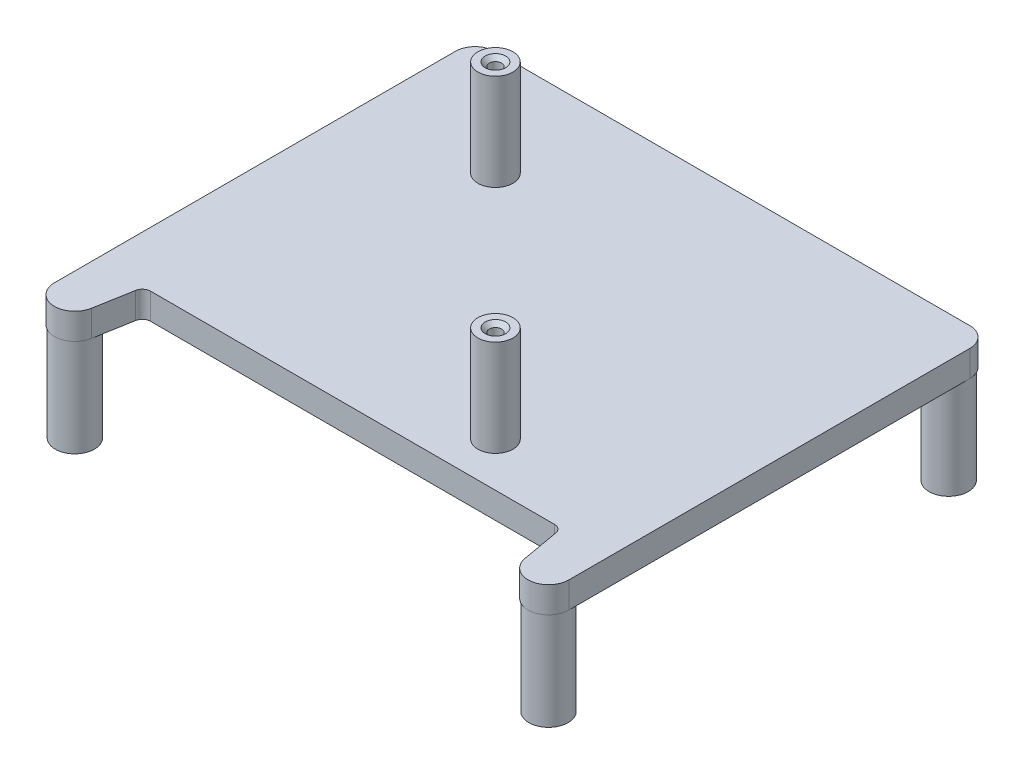
ISO-10303-21;
HEADER;
FILE_DESCRIPTION(('STEP AP214'),'2;1');
FILE_NAME('part.step','',(''),(''),'','','');
FILE_SCHEMA(('AUTOMOTIVE_DESIGN { 1 0 10303 214 1 1 1 1 }'));
ENDSEC;
DATA;
#1=APPLICATION_CONTEXT('core data for automotive mechanical design processes');
#2=APPLICATION_PROTOCOL_DEFINITION('international standard','automotive_design',2000,#1);
#3=PRODUCT_CONTEXT('',#1,'mechanical');
#4=PRODUCT('Part','Part','',(#3));
#5=PRODUCT_RELATED_PRODUCT_CATEGORY('part','',(#4));
#6=PRODUCT_DEFINITION_FORMATION('','',#4);
#7=PRODUCT_DEFINITION_CONTEXT('part definition',#1,'design');
#8=PRODUCT_DEFINITION('design','',#6,#7);
#9=PRODUCT_DEFINITION_SHAPE('','',#8);
#10=(LENGTH_UNIT() NAMED_UNIT(*) SI_UNIT(.MILLI.,.METRE.));
#11=(NAMED_UNIT(*) PLANE_ANGLE_UNIT() SI_UNIT($,.RADIAN.));
#12=(NAMED_UNIT(*) SI_UNIT($,.STERADIAN.) SOLID_ANGLE_UNIT());
#13=UNCERTAINTY_MEASURE_WITH_UNIT(LENGTH_MEASURE(1.E-05),#10,'distance_accuracy_value','');
#14=(GEOMETRIC_REPRESENTATION_CONTEXT(3) GLOBAL_UNCERTAINTY_ASSIGNED_CONTEXT((#13)) GLOBAL_UNIT_ASSIGNED_CONTEXT((#10,
#11,#12)) REPRESENTATION_CONTEXT('',''));
#15=CARTESIAN_POINT('',(0.,0.,0.));
#16=DIRECTION('',(0.,0.,1.));
#17=DIRECTION('',(1.,0.,0.));
#18=AXIS2_PLACEMENT_3D('',#15,#16,#17);
#19=CARTESIAN_POINT('',(-28.9987760738904,0.,24.4987760738904));
#20=DIRECTION('',(0.,-1.,0.));
#21=DIRECTION('',(0.,0.,-1.));
#22=AXIS2_PLACEMENT_3D('',#19,#20,#21);
#23=CYLINDRICAL_SURFACE('',#22,2.50122392610958);
#24=DIRECTION('',(0.,-1.,0.));
#25=VECTOR('',#24,1.);
#26=CARTESIAN_POINT('',(-31.5,3.2,24.4987760738904));
#27=LINE('',#26,#25);
#28=CARTESIAN_POINT('',(-31.5,0.,24.4987760738904));
#29=VERTEX_POINT('',#28);
#30=CARTESIAN_POINT('',(-31.5,3.2,24.4987760738904));
#31=VERTEX_POINT('',#30);
#32=EDGE_CURVE('E257',#29,#31,#27,.F.);
#33=ORIENTED_EDGE('',*,*,#32,.F.);
#34=CARTESIAN_POINT('',(-28.9987760738904,0.,24.4987760738904));
#35=DIRECTION('',(0.,1.,0.));
#36=DIRECTION('',(0.,0.,1.));
#37=AXIS2_PLACEMENT_3D('',#34,#35,#36);
#38=CIRCLE('',#37,2.50122392610958);
#39=CARTESIAN_POINT('',(-26.5355513594381,0.,24.9331090505963));
#40=VERTEX_POINT('',#39);
#41=EDGE_CURVE('E163',#40,#29,#38,.F.);
#42=ORIENTED_EDGE('',*,*,#41,.F.);
#43=DIRECTION('',(0.,1.,0.));
#44=VECTOR('',#43,1.);
#45=CARTESIAN_POINT('',(-26.5355513594381,0.,24.9331090505963));
#46=LINE('',#45,#44);
#47=CARTESIAN_POINT('',(-26.5355513594381,3.2,24.9331090505963));
#48=VERTEX_POINT('',#47);
#49=EDGE_CURVE('E259',#48,#40,#46,.F.);
#50=ORIENTED_EDGE('',*,*,#49,.F.);
#51=CARTESIAN_POINT('',(-28.9987760738904,3.2,24.4987760738904));
#52=DIRECTION('',(0.,1.,0.));
#53=DIRECTION('',(0.,0.,1.));
#54=AXIS2_PLACEMENT_3D('',#51,#52,#53);
#55=CIRCLE('',#54,2.50122392610958);
#56=EDGE_CURVE('E263',#31,#48,#55,.T.);
#57=ORIENTED_EDGE('',*,*,#56,.F.);
#58=EDGE_LOOP('',(#33,#42,#50,#57));
#59=FACE_BOUND('',#58,.T.);
#60=ADVANCED_FACE('F51',(#59),#23,.T.);
#61=CARTESIAN_POINT('',(28.9987760738904,3.2,24.4987760738904));
#62=DIRECTION('',(0.,-1.,0.));
#63=DIRECTION('',(0.,0.,-1.));
#64=AXIS2_PLACEMENT_3D('',#61,#62,#63);
#65=CYLINDRICAL_SURFACE('',#64,2.50122392610958);
#66=DIRECTION('',(0.,1.,0.));
#67=VECTOR('',#66,1.);
#68=CARTESIAN_POINT('',(31.5,3.2,24.4987760738904));
#69=LINE('',#68,#67);
#70=CARTESIAN_POINT('',(31.5,3.2,24.4987760738904));
#71=VERTEX_POINT('',#70);
#72=CARTESIAN_POINT('',(31.5,0.,24.4987760738904));
#73=VERTEX_POINT('',#72);
#74=EDGE_CURVE('E247',#71,#73,#69,.F.);
#75=ORIENTED_EDGE('',*,*,#74,.F.);
#76=CARTESIAN_POINT('',(28.9987760738904,3.2,24.4987760738904));
#77=DIRECTION('',(0.,1.,0.));
#78=DIRECTION('',(0.,0.,1.));
#79=AXIS2_PLACEMENT_3D('',#76,#77,#78);
#80=CIRCLE('',#79,2.50122392610958);
#81=CARTESIAN_POINT('',(26.5355513594381,3.2,24.9331090505963));
#82=VERTEX_POINT('',#81);
#83=EDGE_CURVE('E253',#82,#71,#80,.T.);
#84=ORIENTED_EDGE('',*,*,#83,.F.);
#85=DIRECTION('',(0.,-1.,0.));
#86=VECTOR('',#85,1.);
#87=CARTESIAN_POINT('',(26.5355513594381,3.2,24.9331090505963));
#88=LINE('',#87,#86);
#89=CARTESIAN_POINT('',(26.5355513594381,0.,24.9331090505963));
#90=VERTEX_POINT('',#89);
#91=EDGE_CURVE('E250',#90,#82,#88,.F.);
#92=ORIENTED_EDGE('',*,*,#91,.F.);
#93=CARTESIAN_POINT('',(28.9987760738904,0.,24.4987760738904));
#94=DIRECTION('',(0.,1.,0.));
#95=DIRECTION('',(0.,0.,1.));
#96=AXIS2_PLACEMENT_3D('',#93,#94,#95);
#97=CIRCLE('',#96,2.50122392610958);
#98=EDGE_CURVE('E255',#73,#90,#97,.F.);
#99=ORIENTED_EDGE('',*,*,#98,.F.);
#100=EDGE_LOOP('',(#75,#84,#92,#99));
#101=FACE_BOUND('',#100,.T.);
#102=ADVANCED_FACE('F300',(#101),#65,.T.);
#103=CARTESIAN_POINT('',(0.,3.2,19.5));
#104=DIRECTION('',(0.,0.,-1.));
#105=DIRECTION('',(-1.,0.,0.));
#106=AXIS2_PLACEMENT_3D('',#103,#104,#105);
#107=PLANE('',#106);
#108=DIRECTION('',(1.,0.,0.));
#109=VECTOR('',#108,1.);
#110=CARTESIAN_POINT('',(0.,0.,19.5));
#111=LINE('',#110,#109);
#112=CARTESIAN_POINT('',(-24.7384480135093,0.,19.5));
#113=VERTEX_POINT('',#112);
#114=CARTESIAN_POINT('',(24.7384480135093,0.,19.5));
#115=VERTEX_POINT('',#114);
#116=EDGE_CURVE('E279',#113,#115,#111,.T.);
#117=ORIENTED_EDGE('',*,*,#116,.T.);
#118=DIRECTION('',(0.,-1.,0.));
#119=VECTOR('',#118,1.);
#120=CARTESIAN_POINT('',(24.7384480135093,3.2,19.5));
#121=LINE('',#120,#119);
#122=CARTESIAN_POINT('',(24.7384480135093,3.2,19.5));
#123=VERTEX_POINT('',#122);
#124=EDGE_CURVE('E268',#115,#123,#121,.F.);
#125=ORIENTED_EDGE('',*,*,#124,.T.);
#126=DIRECTION('',(1.,0.,0.));
#127=VECTOR('',#126,1.);
#128=CARTESIAN_POINT('',(0.,3.2,19.5));
#129=LINE('',#128,#127);
#130=CARTESIAN_POINT('',(-24.7384480135093,3.2,19.5));
#131=VERTEX_POINT('',#130);
#132=EDGE_CURVE('E165',#131,#123,#129,.T.);
#133=ORIENTED_EDGE('',*,*,#132,.F.);
#134=DIRECTION('',(0.,-1.,0.));
#135=VECTOR('',#134,1.);
#136=CARTESIAN_POINT('',(-24.7384480135093,3.2,19.5));
#137=LINE('',#136,#135);
#138=EDGE_CURVE('E265',#131,#113,#137,.T.);
#139=ORIENTED_EDGE('',*,*,#138,.T.);
#140=EDGE_LOOP('',(#117,#125,#133,#139));
#141=FACE_BOUND('',#140,.T.);
#142=ADVANCED_FACE('F285',(#141),#107,.F.);
#143=CARTESIAN_POINT('',(31.5,3.2,0.));
#144=DIRECTION('',(1.,0.,0.));
#145=DIRECTION('',(0.,0.,-1.));
#146=AXIS2_PLACEMENT_3D('',#143,#144,#145);
#147=PLANE('',#146);
#148=DIRECTION('',(0.,0.,1.));
#149=VECTOR('',#148,1.);
#150=CARTESIAN_POINT('',(31.5,3.2,0.));
#151=LINE('',#150,#149);
#152=CARTESIAN_POINT('',(31.5,3.2,-24.6));
#153=VERTEX_POINT('',#152);
#154=EDGE_CURVE('E169',#153,#71,#151,.T.);
#155=ORIENTED_EDGE('',*,*,#154,.T.);
#156=ORIENTED_EDGE('',*,*,#74,.T.);
#157=DIRECTION('',(0.,0.,1.));
#158=VECTOR('',#157,1.);
#159=CARTESIAN_POINT('',(31.5,0.,0.));
#160=LINE('',#159,#158);
#161=CARTESIAN_POINT('',(31.5,0.,-24.6));
#162=VERTEX_POINT('',#161);
#163=EDGE_CURVE('E171',#162,#73,#160,.T.);
#164=ORIENTED_EDGE('',*,*,#163,.F.);
#165=DIRECTION('',(0.,-1.,0.));
#166=VECTOR('',#165,1.);
#167=CARTESIAN_POINT('',(31.5,3.2,-24.6));
#168=LINE('',#167,#166);
#169=EDGE_CURVE('E245',#162,#153,#168,.F.);
#170=ORIENTED_EDGE('',*,*,#169,.T.);
#171=EDGE_LOOP('',(#155,#156,#164,#170));
#172=FACE_BOUND('',#171,.T.);
#173=ADVANCED_FACE('F317',(#172),#147,.T.);
#174=CARTESIAN_POINT('',(0.,3.2,-27.));
#175=DIRECTION('',(0.,0.,-1.));
#176=DIRECTION('',(-1.,0.,0.));
#177=AXIS2_PLACEMENT_3D('',#174,#175,#176);
#178=PLANE('',#177);
#179=DIRECTION('',(1.,0.,0.));
#180=VECTOR('',#179,1.);
#181=CARTESIAN_POINT('',(0.,0.,-27.));
#182=LINE('',#181,#180);
#183=CARTESIAN_POINT('',(-29.1,0.,-27.));
#184=VERTEX_POINT('',#183);
#185=CARTESIAN_POINT('',(29.1,0.,-27.));
#186=VERTEX_POINT('',#185);
#187=EDGE_CURVE('E166',#184,#186,#182,.T.);
#188=ORIENTED_EDGE('',*,*,#187,.F.);
#189=DIRECTION('',(0.,-1.,0.));
#190=VECTOR('',#189,1.);
#191=CARTESIAN_POINT('',(-29.1,3.2,-27.));
#192=LINE('',#191,#190);
#193=CARTESIAN_POINT('',(-29.1,3.2,-27.));
#194=VERTEX_POINT('',#193);
#195=EDGE_CURVE('E144',#184,#194,#192,.F.);
#196=ORIENTED_EDGE('',*,*,#195,.T.);
#197=DIRECTION('',(1.,0.,0.));
#198=VECTOR('',#197,1.);
#199=CARTESIAN_POINT('',(0.,3.2,-27.));
#200=LINE('',#199,#198);
#201=CARTESIAN_POINT('',(29.1,3.2,-27.));
#202=VERTEX_POINT('',#201);
#203=EDGE_CURVE('E307',#194,#202,#200,.T.);
#204=ORIENTED_EDGE('',*,*,#203,.T.);
#205=DIRECTION('',(0.,-1.,0.));
#206=VECTOR('',#205,1.);
#207=CARTESIAN_POINT('',(29.1,3.2,-27.));
#208=LINE('',#207,#206);
#209=EDGE_CURVE('E148',#202,#186,#208,.T.);
#210=ORIENTED_EDGE('',*,*,#209,.T.);
#211=EDGE_LOOP('',(#188,#196,#204,#210));
#212=FACE_BOUND('',#211,.T.);
#213=ADVANCED_FACE('F314',(#212),#178,.T.);
#214=CARTESIAN_POINT('',(-31.5,3.2,0.));
#215=DIRECTION('',(1.,0.,0.));
#216=DIRECTION('',(0.,0.,-1.));
#217=AXIS2_PLACEMENT_3D('',#214,#215,#216);
#218=PLANE('',#217);
#219=DIRECTION('',(0.,0.,1.));
#220=VECTOR('',#219,1.);
#221=CARTESIAN_POINT('',(-31.5,0.,0.));
#222=LINE('',#221,#220);
#223=CARTESIAN_POINT('',(-31.5,0.,-24.6));
#224=VERTEX_POINT('',#223);
#225=EDGE_CURVE('E156',#224,#29,#222,.T.);
#226=ORIENTED_EDGE('',*,*,#225,.T.);
#227=ORIENTED_EDGE('',*,*,#32,.T.);
#228=DIRECTION('',(0.,0.,1.));
#229=VECTOR('',#228,1.);
#230=CARTESIAN_POINT('',(-31.5,3.2,0.));
#231=LINE('',#230,#229);
#232=CARTESIAN_POINT('',(-31.5,3.2,-24.6));
#233=VERTEX_POINT('',#232);
#234=EDGE_CURVE('E158',#233,#31,#231,.T.);
#235=ORIENTED_EDGE('',*,*,#234,.F.);
#236=DIRECTION('',(0.,-1.,0.));
#237=VECTOR('',#236,1.);
#238=CARTESIAN_POINT('',(-31.5,0.,-24.6));
#239=LINE('',#238,#237);
#240=EDGE_CURVE('E143',#233,#224,#239,.T.);
#241=ORIENTED_EDGE('',*,*,#240,.T.);
#242=EDGE_LOOP('',(#226,#227,#235,#241));
#243=FACE_BOUND('',#242,.T.);
#244=ADVANCED_FACE('F154',(#243),#218,.F.);
#245=CARTESIAN_POINT('',(0.,3.2,0.));
#246=DIRECTION('',(0.,1.,0.));
#247=DIRECTION('',(0.,0.,1.));
#248=AXIS2_PLACEMENT_3D('',#245,#246,#247);
#249=PLANE('',#248);
#250=CARTESIAN_POINT('',(12.075,3.2,14.075));
#251=DIRECTION('',(0.,1.,0.));
#252=DIRECTION('',(0.,0.,1.));
#253=AXIS2_PLACEMENT_3D('',#250,#251,#252);
#254=CIRCLE('',#253,2.15);
#255=CARTESIAN_POINT('',(12.075,3.2,16.225));
#256=VERTEX_POINT('',#255);
#257=EDGE_CURVE('E351',#256,#256,#254,.T.);
#258=ORIENTED_EDGE('',*,*,#257,.F.);
#259=EDGE_LOOP('',(#258));
#260=FACE_BOUND('',#259,.T.);
#261=CARTESIAN_POINT('',(-16.125,3.2,-14.125));
#262=DIRECTION('',(0.,1.,0.));
#263=DIRECTION('',(0.,0.,1.));
#264=AXIS2_PLACEMENT_3D('',#261,#262,#263);
#265=CIRCLE('',#264,2.15);
#266=CARTESIAN_POINT('',(-16.125,3.2,-11.975));
#267=VERTEX_POINT('',#266);
#268=EDGE_CURVE('E345',#267,#267,#265,.T.);
#269=ORIENTED_EDGE('',*,*,#268,.F.);
#270=EDGE_LOOP('',(#269));
#271=FACE_BOUND('',#270,.T.);
#272=ORIENTED_EDGE('',*,*,#234,.T.);
#273=ORIENTED_EDGE('',*,*,#56,.T.);
#274=DIRECTION('',(0.173648177666927,0.,-0.984807753012209));
#275=VECTOR('',#274,1.);
#276=CARTESIAN_POINT('',(-21.4715938146741,3.2,-3.78602130833997));
#277=LINE('',#276,#275);
#278=CARTESIAN_POINT('',(-25.7232557665215,3.2,20.3263518223331));
#279=VERTEX_POINT('',#278);
#280=EDGE_CURVE('E234',#48,#279,#277,.T.);
#281=ORIENTED_EDGE('',*,*,#280,.T.);
#282=CARTESIAN_POINT('',(-24.7384480135093,3.2,20.5));
#283=DIRECTION('',(0.,1.,0.));
#284=DIRECTION('',(0.,0.,1.));
#285=AXIS2_PLACEMENT_3D('',#282,#283,#284);
#286=CIRCLE('',#285,1.);
#287=EDGE_CURVE('E12',#279,#131,#286,.F.);
#288=ORIENTED_EDGE('',*,*,#287,.T.);
#289=ORIENTED_EDGE('',*,*,#132,.T.);
#290=CARTESIAN_POINT('',(24.7384480135093,3.2,20.5));
#291=DIRECTION('',(0.,1.,0.));
#292=DIRECTION('',(0.,0.,1.));
#293=AXIS2_PLACEMENT_3D('',#290,#291,#292);
#294=CIRCLE('',#293,1.);
#295=CARTESIAN_POINT('',(25.7232557665215,3.2,20.3263518223331));
#296=VERTEX_POINT('',#295);
#297=EDGE_CURVE('E274',#123,#296,#294,.F.);
#298=ORIENTED_EDGE('',*,*,#297,.T.);
#299=DIRECTION('',(-0.173648177666927,0.,-0.984807753012209));
#300=VECTOR('',#299,1.);
#301=CARTESIAN_POINT('',(21.4715938146741,3.2,-3.78602130833997));
#302=LINE('',#301,#300);
#303=EDGE_CURVE('E159',#296,#82,#302,.F.);
#304=ORIENTED_EDGE('',*,*,#303,.T.);
#305=ORIENTED_EDGE('',*,*,#83,.T.);
#306=ORIENTED_EDGE('',*,*,#154,.F.);
#307=CARTESIAN_POINT('',(29.1,3.2,-24.6));
#308=DIRECTION('',(0.,1.,0.));
#309=DIRECTION('',(0.,0.,1.));
#310=AXIS2_PLACEMENT_3D('',#307,#308,#309);
#311=CIRCLE('',#310,2.4);
#312=EDGE_CURVE('E241',#153,#202,#311,.T.);
#313=ORIENTED_EDGE('',*,*,#312,.T.);
#314=ORIENTED_EDGE('',*,*,#203,.F.);
#315=CARTESIAN_POINT('',(-29.1,3.2,-24.6));
#316=DIRECTION('',(0.,1.,0.));
#317=DIRECTION('',(0.,0.,1.));
#318=AXIS2_PLACEMENT_3D('',#315,#316,#317);
#319=CIRCLE('',#318,2.4);
#320=EDGE_CURVE('E243',#194,#233,#319,.T.);
#321=ORIENTED_EDGE('',*,*,#320,.T.);
#322=EDGE_LOOP('',(#272,#273,#281,#288,#289,#298,#304,#305,#306,#313,#314,#321));
#323=FACE_BOUND('',#322,.T.);
#324=ADVANCED_FACE('F293',(#260,#271,#323),#249,.T.);
#325=CARTESIAN_POINT('',(0.,0.,0.));
#326=DIRECTION('',(0.,1.,0.));
#327=DIRECTION('',(0.,0.,1.));
#328=AXIS2_PLACEMENT_3D('',#325,#326,#327);
#329=PLANE('',#328);
#330=CARTESIAN_POINT('',(-29.,0.,24.5));
#331=DIRECTION('',(0.,1.,0.));
#332=DIRECTION('',(0.,0.,1.));
#333=AXIS2_PLACEMENT_3D('',#330,#331,#332);
#334=CIRCLE('',#333,2.4);
#335=CARTESIAN_POINT('',(-29.,0.,26.9));
#336=VERTEX_POINT('',#335);
#337=EDGE_CURVE('E184',#336,#336,#334,.F.);
#338=ORIENTED_EDGE('',*,*,#337,.F.);
#339=EDGE_LOOP('',(#338));
#340=FACE_BOUND('',#339,.T.);
#341=CARTESIAN_POINT('',(29.,0.,24.5));
#342=DIRECTION('',(0.,1.,0.));
#343=DIRECTION('',(0.,0.,1.));
#344=AXIS2_PLACEMENT_3D('',#341,#342,#343);
#345=CIRCLE('',#344,2.4);
#346=CARTESIAN_POINT('',(29.,0.,26.9));
#347=VERTEX_POINT('',#346);
#348=EDGE_CURVE('E181',#347,#347,#345,.F.);
#349=ORIENTED_EDGE('',*,*,#348,.F.);
#350=EDGE_LOOP('',(#349));
#351=FACE_BOUND('',#350,.T.);
#352=CARTESIAN_POINT('',(29.,0.,-24.5));
#353=DIRECTION('',(0.,1.,0.));
#354=DIRECTION('',(0.,0.,1.));
#355=AXIS2_PLACEMENT_3D('',#352,#353,#354);
#356=CIRCLE('',#355,2.4);
#357=CARTESIAN_POINT('',(29.,0.,-22.1));
#358=VERTEX_POINT('',#357);
#359=EDGE_CURVE('E178',#358,#358,#356,.F.);
#360=ORIENTED_EDGE('',*,*,#359,.F.);
#361=EDGE_LOOP('',(#360));
#362=FACE_BOUND('',#361,.T.);
#363=CARTESIAN_POINT('',(-29.,0.,-24.5));
#364=DIRECTION('',(0.,1.,0.));
#365=DIRECTION('',(0.,0.,1.));
#366=AXIS2_PLACEMENT_3D('',#363,#364,#365);
#367=CIRCLE('',#366,2.4);
#368=CARTESIAN_POINT('',(-29.,0.,-22.1));
#369=VERTEX_POINT('',#368);
#370=EDGE_CURVE('E175',#369,#369,#367,.F.);
#371=ORIENTED_EDGE('',*,*,#370,.F.);
#372=EDGE_LOOP('',(#371));
#373=FACE_BOUND('',#372,.T.);
#374=ORIENTED_EDGE('',*,*,#116,.F.);
#375=CARTESIAN_POINT('',(-24.7384480135093,0.,20.5));
#376=DIRECTION('',(0.,1.,0.));
#377=DIRECTION('',(0.,0.,1.));
#378=AXIS2_PLACEMENT_3D('',#375,#376,#377);
#379=CIRCLE('',#378,1.);
#380=CARTESIAN_POINT('',(-25.7232557665215,0.,20.3263518223331));
#381=VERTEX_POINT('',#380);
#382=EDGE_CURVE('E59',#113,#381,#379,.T.);
#383=ORIENTED_EDGE('',*,*,#382,.T.);
#384=DIRECTION('',(-0.173648177666927,0.,0.984807753012209));
#385=VECTOR('',#384,1.);
#386=CARTESIAN_POINT('',(-25.,0.,16.2245645427257));
#387=LINE('',#386,#385);
#388=EDGE_CURVE('E229',#381,#40,#387,.T.);
#389=ORIENTED_EDGE('',*,*,#388,.T.);
#390=ORIENTED_EDGE('',*,*,#41,.T.);
#391=ORIENTED_EDGE('',*,*,#225,.F.);
#392=CARTESIAN_POINT('',(-29.1,0.,-24.6));
#393=DIRECTION('',(0.,1.,0.));
#394=DIRECTION('',(0.,0.,1.));
#395=AXIS2_PLACEMENT_3D('',#392,#393,#394);
#396=CIRCLE('',#395,2.4);
#397=EDGE_CURVE('E139',#224,#184,#396,.F.);
#398=ORIENTED_EDGE('',*,*,#397,.T.);
#399=ORIENTED_EDGE('',*,*,#187,.T.);
#400=CARTESIAN_POINT('',(29.1,0.,-24.6));
#401=DIRECTION('',(0.,1.,0.));
#402=DIRECTION('',(0.,0.,1.));
#403=AXIS2_PLACEMENT_3D('',#400,#401,#402);
#404=CIRCLE('',#403,2.4);
#405=EDGE_CURVE('E149',#186,#162,#404,.F.);
#406=ORIENTED_EDGE('',*,*,#405,.T.);
#407=ORIENTED_EDGE('',*,*,#163,.T.);
#408=ORIENTED_EDGE('',*,*,#98,.T.);
#409=DIRECTION('',(0.173648177666927,0.,0.984807753012209));
#410=VECTOR('',#409,1.);
#411=CARTESIAN_POINT('',(26.9000000000001,0.,27.));
#412=LINE('',#411,#410);
#413=CARTESIAN_POINT('',(25.7232557665215,0.,20.3263518223331));
#414=VERTEX_POINT('',#413);
#415=EDGE_CURVE('E231',#90,#414,#412,.F.);
#416=ORIENTED_EDGE('',*,*,#415,.T.);
#417=CARTESIAN_POINT('',(24.7384480135093,0.,20.5));
#418=DIRECTION('',(0.,1.,0.));
#419=DIRECTION('',(0.,0.,1.));
#420=AXIS2_PLACEMENT_3D('',#417,#418,#419);
#421=CIRCLE('',#420,1.);
#422=EDGE_CURVE('E276',#414,#115,#421,.T.);
#423=ORIENTED_EDGE('',*,*,#422,.T.);
#424=EDGE_LOOP('',(#374,#383,#389,#390,#391,#398,#399,#406,#407,#408,#416,#423));
#425=FACE_BOUND('',#424,.T.);
#426=ADVANCED_FACE('F161',(#340,#351,#362,#373,#425),#329,.F.);
#427=CARTESIAN_POINT('',(-29.,-12.,-24.5));
#428=DIRECTION('',(0.,-1.,0.));
#429=DIRECTION('',(0.,0.,-1.));
#430=AXIS2_PLACEMENT_3D('',#427,#428,#429);
#431=PLANE('',#430);
#432=CARTESIAN_POINT('',(-29.,-12.,-24.5));
#433=DIRECTION('',(0.,-1.,0.));
#434=DIRECTION('',(0.,0.,-1.));
#435=AXIS2_PLACEMENT_3D('',#432,#433,#434);
#436=CIRCLE('',#435,1.25000000000001);
#437=CARTESIAN_POINT('',(-29.,-12.,-25.75));
#438=VERTEX_POINT('',#437);
#439=EDGE_CURVE('E214',#438,#438,#436,.F.);
#440=ORIENTED_EDGE('',*,*,#439,.T.);
#441=EDGE_LOOP('',(#440));
#442=FACE_BOUND('',#441,.T.);
#443=CARTESIAN_POINT('',(-29.,-12.,-24.5));
#444=DIRECTION('',(0.,-1.,0.));
#445=DIRECTION('',(0.,0.,-1.));
#446=AXIS2_PLACEMENT_3D('',#443,#444,#445);
#447=CIRCLE('',#446,2.4);
#448=CARTESIAN_POINT('',(-29.,-12.,-26.9));
#449=VERTEX_POINT('',#448);
#450=EDGE_CURVE('E288',#449,#449,#447,.T.);
#451=ORIENTED_EDGE('',*,*,#450,.T.);
#452=EDGE_LOOP('',(#451));
#453=FACE_BOUND('',#452,.T.);
#454=ADVANCED_FACE('F475',(#442,#453),#431,.T.);
#455=CARTESIAN_POINT('',(-29.,-12.,-24.5));
#456=DIRECTION('',(0.,1.,0.));
#457=DIRECTION('',(0.,0.,1.));
#458=AXIS2_PLACEMENT_3D('',#455,#456,#457);
#459=CYLINDRICAL_SURFACE('',#458,2.4);
#460=ORIENTED_EDGE('',*,*,#450,.F.);
#461=EDGE_LOOP('',(#460));
#462=FACE_BOUND('',#461,.T.);
#463=ORIENTED_EDGE('',*,*,#370,.T.);
#464=EDGE_LOOP('',(#463));
#465=FACE_BOUND('',#464,.T.);
#466=ADVANCED_FACE('F479',(#462,#465),#459,.T.);
#467=CARTESIAN_POINT('',(-29.,-12.,-24.5));
#468=DIRECTION('',(0.,1.,0.));
#469=DIRECTION('',(0.,0.,1.));
#470=AXIS2_PLACEMENT_3D('',#467,#468,#469);
#471=CYLINDRICAL_SURFACE('',#470,0.750000000000002);
#472=CARTESIAN_POINT('',(-29.,-11.5,-24.5));
#473=DIRECTION('',(0.,-1.,0.));
#474=DIRECTION('',(0.,0.,-1.));
#475=AXIS2_PLACEMENT_3D('',#472,#473,#474);
#476=CIRCLE('',#475,0.750000000000002);
#477=CARTESIAN_POINT('',(-29.,-11.5,-25.25));
#478=VERTEX_POINT('',#477);
#479=EDGE_CURVE('E211',#478,#478,#476,.T.);
#480=ORIENTED_EDGE('',*,*,#479,.T.);
#481=EDGE_LOOP('',(#480));
#482=FACE_BOUND('',#481,.T.);
#483=CARTESIAN_POINT('',(-29.,0.,-24.5));
#484=DIRECTION('',(0.,-1.,0.));
#485=DIRECTION('',(0.,0.,-1.));
#486=AXIS2_PLACEMENT_3D('',#483,#484,#485);
#487=CIRCLE('',#486,0.750000000000002);
#488=CARTESIAN_POINT('',(-29.,0.,-25.25));
#489=VERTEX_POINT('',#488);
#490=EDGE_CURVE('E323',#489,#489,#487,.T.);
#491=ORIENTED_EDGE('',*,*,#490,.F.);
#492=EDGE_LOOP('',(#491));
#493=FACE_BOUND('',#492,.T.);
#494=ADVANCED_FACE('F482',(#482,#493),#471,.F.);
#495=ORIENTED_EDGE('',*,*,#490,.T.);
#496=EDGE_LOOP('',(#495));
#497=FACE_BOUND('',#496,.T.);
#498=ADVANCED_FACE('F477',(#497),#329,.F.);
#499=CARTESIAN_POINT('',(29.,-12.,-24.5));
#500=DIRECTION('',(0.,1.,0.));
#501=DIRECTION('',(0.,0.,1.));
#502=AXIS2_PLACEMENT_3D('',#499,#500,#501);
#503=PLANE('',#502);
#504=CARTESIAN_POINT('',(29.,-12.,-24.5));
#505=DIRECTION('',(0.,1.,0.));
#506=DIRECTION('',(0.,0.,1.));
#507=AXIS2_PLACEMENT_3D('',#504,#505,#506);
#508=CIRCLE('',#507,1.25000000000001);
#509=CARTESIAN_POINT('',(29.,-12.,-23.25));
#510=VERTEX_POINT('',#509);
#511=EDGE_CURVE('E208',#510,#510,#508,.T.);
#512=ORIENTED_EDGE('',*,*,#511,.T.);
#513=EDGE_LOOP('',(#512));
#514=FACE_BOUND('',#513,.T.);
#515=CARTESIAN_POINT('',(29.,-12.,-24.5));
#516=DIRECTION('',(0.,-1.,0.));
#517=DIRECTION('',(0.,0.,1.));
#518=AXIS2_PLACEMENT_3D('',#515,#516,#517);
#519=CIRCLE('',#518,2.4);
#520=CARTESIAN_POINT('',(29.,-12.,-22.1));
#521=VERTEX_POINT('',#520);
#522=EDGE_CURVE('E326',#521,#521,#519,.T.);
#523=ORIENTED_EDGE('',*,*,#522,.T.);
#524=EDGE_LOOP('',(#523));
#525=FACE_BOUND('',#524,.T.);
#526=ADVANCED_FACE('F494',(#514,#525),#503,.F.);
#527=CARTESIAN_POINT('',(29.,-12.,-24.5));
#528=DIRECTION('',(0.,1.,0.));
#529=DIRECTION('',(0.,0.,1.));
#530=AXIS2_PLACEMENT_3D('',#527,#528,#529);
#531=CYLINDRICAL_SURFACE('',#530,2.4);
#532=ORIENTED_EDGE('',*,*,#522,.F.);
#533=EDGE_LOOP('',(#532));
#534=FACE_BOUND('',#533,.T.);
#535=ORIENTED_EDGE('',*,*,#359,.T.);
#536=EDGE_LOOP('',(#535));
#537=FACE_BOUND('',#536,.T.);
#538=ADVANCED_FACE('F490',(#534,#537),#531,.T.);
#539=CARTESIAN_POINT('',(29.,-12.,-24.5));
#540=DIRECTION('',(0.,1.,0.));
#541=DIRECTION('',(0.,0.,1.));
#542=AXIS2_PLACEMENT_3D('',#539,#540,#541);
#543=CYLINDRICAL_SURFACE('',#542,0.750000000000002);
#544=CARTESIAN_POINT('',(29.,-11.5,-24.5));
#545=DIRECTION('',(0.,1.,0.));
#546=DIRECTION('',(0.,0.,1.));
#547=AXIS2_PLACEMENT_3D('',#544,#545,#546);
#548=CIRCLE('',#547,0.750000000000002);
#549=CARTESIAN_POINT('',(29.,-11.5,-23.75));
#550=VERTEX_POINT('',#549);
#551=EDGE_CURVE('E205',#550,#550,#548,.F.);
#552=ORIENTED_EDGE('',*,*,#551,.T.);
#553=EDGE_LOOP('',(#552));
#554=FACE_BOUND('',#553,.T.);
#555=CARTESIAN_POINT('',(29.,0.,-24.5));
#556=DIRECTION('',(0.,-1.,0.));
#557=DIRECTION('',(0.,0.,1.));
#558=AXIS2_PLACEMENT_3D('',#555,#556,#557);
#559=CIRCLE('',#558,0.750000000000002);
#560=CARTESIAN_POINT('',(29.,0.,-23.75));
#561=VERTEX_POINT('',#560);
#562=EDGE_CURVE('E329',#561,#561,#559,.T.);
#563=ORIENTED_EDGE('',*,*,#562,.F.);
#564=EDGE_LOOP('',(#563));
#565=FACE_BOUND('',#564,.T.);
#566=ADVANCED_FACE('F493',(#554,#565),#543,.F.);
#567=ORIENTED_EDGE('',*,*,#562,.T.);
#568=EDGE_LOOP('',(#567));
#569=FACE_BOUND('',#568,.T.);
#570=ADVANCED_FACE('F501',(#569),#329,.F.);
#571=CARTESIAN_POINT('',(29.,-12.,24.5));
#572=DIRECTION('',(0.,-1.,0.));
#573=DIRECTION('',(0.,0.,-1.));
#574=AXIS2_PLACEMENT_3D('',#571,#572,#573);
#575=PLANE('',#574);
#576=CARTESIAN_POINT('',(29.,-12.,24.5));
#577=DIRECTION('',(0.,-1.,0.));
#578=DIRECTION('',(0.,0.,-1.));
#579=AXIS2_PLACEMENT_3D('',#576,#577,#578);
#580=CIRCLE('',#579,1.25000000000001);
#581=CARTESIAN_POINT('',(29.,-12.,23.25));
#582=VERTEX_POINT('',#581);
#583=EDGE_CURVE('E202',#582,#582,#580,.F.);
#584=ORIENTED_EDGE('',*,*,#583,.T.);
#585=EDGE_LOOP('',(#584));
#586=FACE_BOUND('',#585,.T.);
#587=CARTESIAN_POINT('',(29.,-12.,24.5));
#588=DIRECTION('',(0.,-1.,0.));
#589=DIRECTION('',(0.,0.,-1.));
#590=AXIS2_PLACEMENT_3D('',#587,#588,#589);
#591=CIRCLE('',#590,2.4);
#592=CARTESIAN_POINT('',(29.,-12.,22.1));
#593=VERTEX_POINT('',#592);
#594=EDGE_CURVE('E332',#593,#593,#591,.T.);
#595=ORIENTED_EDGE('',*,*,#594,.T.);
#596=EDGE_LOOP('',(#595));
#597=FACE_BOUND('',#596,.T.);
#598=ADVANCED_FACE('F507',(#586,#597),#575,.T.);
#599=CARTESIAN_POINT('',(29.,-12.,24.5));
#600=DIRECTION('',(0.,1.,0.));
#601=DIRECTION('',(0.,0.,1.));
#602=AXIS2_PLACEMENT_3D('',#599,#600,#601);
#603=CYLINDRICAL_SURFACE('',#602,2.4);
#604=ORIENTED_EDGE('',*,*,#594,.F.);
#605=EDGE_LOOP('',(#604));
#606=FACE_BOUND('',#605,.T.);
#607=ORIENTED_EDGE('',*,*,#348,.T.);
#608=EDGE_LOOP('',(#607));
#609=FACE_BOUND('',#608,.T.);
#610=ADVANCED_FACE('F503',(#606,#609),#603,.T.);
#611=CARTESIAN_POINT('',(29.,-12.,24.5));
#612=DIRECTION('',(0.,1.,0.));
#613=DIRECTION('',(0.,0.,1.));
#614=AXIS2_PLACEMENT_3D('',#611,#612,#613);
#615=CYLINDRICAL_SURFACE('',#614,0.750000000000002);
#616=CARTESIAN_POINT('',(29.,-11.5,24.5));
#617=DIRECTION('',(0.,-1.,0.));
#618=DIRECTION('',(0.,0.,-1.));
#619=AXIS2_PLACEMENT_3D('',#616,#617,#618);
#620=CIRCLE('',#619,0.750000000000002);
#621=CARTESIAN_POINT('',(29.,-11.5,23.75));
#622=VERTEX_POINT('',#621);
#623=EDGE_CURVE('E199',#622,#622,#620,.T.);
#624=ORIENTED_EDGE('',*,*,#623,.T.);
#625=EDGE_LOOP('',(#624));
#626=FACE_BOUND('',#625,.T.);
#627=CARTESIAN_POINT('',(29.,0.,24.5));
#628=DIRECTION('',(0.,-1.,0.));
#629=DIRECTION('',(0.,0.,-1.));
#630=AXIS2_PLACEMENT_3D('',#627,#628,#629);
#631=CIRCLE('',#630,0.750000000000002);
#632=CARTESIAN_POINT('',(29.,0.,23.75));
#633=VERTEX_POINT('',#632);
#634=EDGE_CURVE('E335',#633,#633,#631,.T.);
#635=ORIENTED_EDGE('',*,*,#634,.F.);
#636=EDGE_LOOP('',(#635));
#637=FACE_BOUND('',#636,.T.);
#638=ADVANCED_FACE('F506',(#626,#637),#615,.F.);
#639=ORIENTED_EDGE('',*,*,#634,.T.);
#640=EDGE_LOOP('',(#639));
#641=FACE_BOUND('',#640,.T.);
#642=ADVANCED_FACE('F514',(#641),#329,.F.);
#643=CARTESIAN_POINT('',(-29.,-12.,24.5));
#644=DIRECTION('',(0.,1.,0.));
#645=DIRECTION('',(0.,0.,1.));
#646=AXIS2_PLACEMENT_3D('',#643,#644,#645);
#647=PLANE('',#646);
#648=CARTESIAN_POINT('',(-29.,-12.,24.5));
#649=DIRECTION('',(0.,1.,0.));
#650=DIRECTION('',(0.,0.,1.));
#651=AXIS2_PLACEMENT_3D('',#648,#649,#650);
#652=CIRCLE('',#651,1.25000000000001);
#653=CARTESIAN_POINT('',(-29.,-12.,25.75));
#654=VERTEX_POINT('',#653);
#655=EDGE_CURVE('E196',#654,#654,#652,.T.);
#656=ORIENTED_EDGE('',*,*,#655,.T.);
#657=EDGE_LOOP('',(#656));
#658=FACE_BOUND('',#657,.T.);
#659=CARTESIAN_POINT('',(-29.,-12.,24.5));
#660=DIRECTION('',(0.,-1.,0.));
#661=DIRECTION('',(0.,0.,1.));
#662=AXIS2_PLACEMENT_3D('',#659,#660,#661);
#663=CIRCLE('',#662,2.4);
#664=CARTESIAN_POINT('',(-29.,-12.,26.9));
#665=VERTEX_POINT('',#664);
#666=EDGE_CURVE('E338',#665,#665,#663,.T.);
#667=ORIENTED_EDGE('',*,*,#666,.T.);
#668=EDGE_LOOP('',(#667));
#669=FACE_BOUND('',#668,.T.);
#670=ADVANCED_FACE('F520',(#658,#669),#647,.F.);
#671=CARTESIAN_POINT('',(-29.,-12.,24.5));
#672=DIRECTION('',(0.,1.,0.));
#673=DIRECTION('',(0.,0.,1.));
#674=AXIS2_PLACEMENT_3D('',#671,#672,#673);
#675=CYLINDRICAL_SURFACE('',#674,2.4);
#676=ORIENTED_EDGE('',*,*,#666,.F.);
#677=EDGE_LOOP('',(#676));
#678=FACE_BOUND('',#677,.T.);
#679=ORIENTED_EDGE('',*,*,#337,.T.);
#680=EDGE_LOOP('',(#679));
#681=FACE_BOUND('',#680,.T.);
#682=ADVANCED_FACE('F516',(#678,#681),#675,.T.);
#683=CARTESIAN_POINT('',(-29.,-12.,24.5));
#684=DIRECTION('',(0.,1.,0.));
#685=DIRECTION('',(0.,0.,1.));
#686=AXIS2_PLACEMENT_3D('',#683,#684,#685);
#687=CYLINDRICAL_SURFACE('',#686,0.750000000000002);
#688=CARTESIAN_POINT('',(-29.,-11.5,24.5));
#689=DIRECTION('',(0.,1.,0.));
#690=DIRECTION('',(0.,0.,1.));
#691=AXIS2_PLACEMENT_3D('',#688,#689,#690);
#692=CIRCLE('',#691,0.750000000000002);
#693=CARTESIAN_POINT('',(-29.,-11.5,25.25));
#694=VERTEX_POINT('',#693);
#695=EDGE_CURVE('E193',#694,#694,#692,.F.);
#696=ORIENTED_EDGE('',*,*,#695,.T.);
#697=EDGE_LOOP('',(#696));
#698=FACE_BOUND('',#697,.T.);
#699=CARTESIAN_POINT('',(-29.,0.,24.5));
#700=DIRECTION('',(0.,-1.,0.));
#701=DIRECTION('',(0.,0.,1.));
#702=AXIS2_PLACEMENT_3D('',#699,#700,#701);
#703=CIRCLE('',#702,0.750000000000002);
#704=CARTESIAN_POINT('',(-29.,0.,25.25));
#705=VERTEX_POINT('',#704);
#706=EDGE_CURVE('E341',#705,#705,#703,.T.);
#707=ORIENTED_EDGE('',*,*,#706,.F.);
#708=EDGE_LOOP('',(#707));
#709=FACE_BOUND('',#708,.T.);
#710=ADVANCED_FACE('F519',(#698,#709),#687,.F.);
#711=ORIENTED_EDGE('',*,*,#706,.T.);
#712=EDGE_LOOP('',(#711));
#713=FACE_BOUND('',#712,.T.);
#714=ADVANCED_FACE('F385',(#713),#329,.F.);
#715=CARTESIAN_POINT('',(-16.125,15.,-14.125));
#716=DIRECTION('',(0.,1.,0.));
#717=DIRECTION('',(0.,0.,1.));
#718=AXIS2_PLACEMENT_3D('',#715,#716,#717);
#719=PLANE('',#718);
#720=CARTESIAN_POINT('',(-16.125,15.,-14.125));
#721=DIRECTION('',(0.,1.,0.));
#722=DIRECTION('',(0.,0.,1.));
#723=AXIS2_PLACEMENT_3D('',#720,#721,#722);
#724=CIRCLE('',#723,1.25000000000001);
#725=CARTESIAN_POINT('',(-16.125,15.,-12.875));
#726=VERTEX_POINT('',#725);
#727=EDGE_CURVE('E220',#726,#726,#724,.F.);
#728=ORIENTED_EDGE('',*,*,#727,.T.);
#729=EDGE_LOOP('',(#728));
#730=FACE_BOUND('',#729,.T.);
#731=CARTESIAN_POINT('',(-16.125,15.,-14.125));
#732=DIRECTION('',(0.,1.,0.));
#733=DIRECTION('',(0.,0.,1.));
#734=AXIS2_PLACEMENT_3D('',#731,#732,#733);
#735=CIRCLE('',#734,2.15);
#736=CARTESIAN_POINT('',(-16.125,15.,-11.975));
#737=VERTEX_POINT('',#736);
#738=EDGE_CURVE('E344',#737,#737,#735,.T.);
#739=ORIENTED_EDGE('',*,*,#738,.T.);
#740=EDGE_LOOP('',(#739));
#741=FACE_BOUND('',#740,.T.);
#742=ADVANCED_FACE('F376',(#730,#741),#719,.T.);
#743=CARTESIAN_POINT('',(-16.125,15.,-14.125));
#744=DIRECTION('',(0.,-1.,0.));
#745=DIRECTION('',(0.,0.,-1.));
#746=AXIS2_PLACEMENT_3D('',#743,#744,#745);
#747=CYLINDRICAL_SURFACE('',#746,2.15);
#748=ORIENTED_EDGE('',*,*,#738,.F.);
#749=EDGE_LOOP('',(#748));
#750=FACE_BOUND('',#749,.T.);
#751=ORIENTED_EDGE('',*,*,#268,.T.);
#752=EDGE_LOOP('',(#751));
#753=FACE_BOUND('',#752,.T.);
#754=ADVANCED_FACE('F373',(#750,#753),#747,.T.);
#755=CARTESIAN_POINT('',(-16.125,15.,-14.125));
#756=DIRECTION('',(0.,-1.,0.));
#757=DIRECTION('',(0.,0.,-1.));
#758=AXIS2_PLACEMENT_3D('',#755,#756,#757);
#759=CYLINDRICAL_SURFACE('',#758,0.75);
#760=CARTESIAN_POINT('',(-16.125,14.5,-14.125));
#761=DIRECTION('',(0.,1.,0.));
#762=DIRECTION('',(0.,0.,1.));
#763=AXIS2_PLACEMENT_3D('',#760,#761,#762);
#764=CIRCLE('',#763,0.75);
#765=CARTESIAN_POINT('',(-16.125,14.5,-13.375));
#766=VERTEX_POINT('',#765);
#767=EDGE_CURVE('E217',#766,#766,#764,.T.);
#768=ORIENTED_EDGE('',*,*,#767,.T.);
#769=EDGE_LOOP('',(#768));
#770=FACE_BOUND('',#769,.T.);
#771=CARTESIAN_POINT('',(-16.125,3.2,-14.125));
#772=DIRECTION('',(0.,1.,0.));
#773=DIRECTION('',(0.,0.,1.));
#774=AXIS2_PLACEMENT_3D('',#771,#772,#773);
#775=CIRCLE('',#774,0.75);
#776=CARTESIAN_POINT('',(-16.125,3.2,-13.375));
#777=VERTEX_POINT('',#776);
#778=EDGE_CURVE('E187',#777,#777,#775,.F.);
#779=ORIENTED_EDGE('',*,*,#778,.T.);
#780=EDGE_LOOP('',(#779));
#781=FACE_BOUND('',#780,.T.);
#782=ADVANCED_FACE('F375',(#770,#781),#759,.F.);
#783=ORIENTED_EDGE('',*,*,#778,.F.);
#784=EDGE_LOOP('',(#783));
#785=FACE_BOUND('',#784,.T.);
#786=ADVANCED_FACE('F370',(#785),#249,.T.);
#787=CARTESIAN_POINT('',(12.075,15.,14.075));
#788=DIRECTION('',(0.,1.,0.));
#789=DIRECTION('',(0.,0.,1.));
#790=AXIS2_PLACEMENT_3D('',#787,#788,#789);
#791=PLANE('',#790);
#792=CARTESIAN_POINT('',(12.075,15.,14.075));
#793=DIRECTION('',(0.,1.,0.));
#794=DIRECTION('',(0.,0.,1.));
#795=AXIS2_PLACEMENT_3D('',#792,#793,#794);
#796=CIRCLE('',#795,1.25000000000001);
#797=CARTESIAN_POINT('',(12.075,15.,15.325));
#798=VERTEX_POINT('',#797);
#799=EDGE_CURVE('E226',#798,#798,#796,.F.);
#800=ORIENTED_EDGE('',*,*,#799,.T.);
#801=EDGE_LOOP('',(#800));
#802=FACE_BOUND('',#801,.T.);
#803=CARTESIAN_POINT('',(12.075,15.,14.075));
#804=DIRECTION('',(0.,1.,0.));
#805=DIRECTION('',(0.,0.,1.));
#806=AXIS2_PLACEMENT_3D('',#803,#804,#805);
#807=CIRCLE('',#806,2.15);
#808=CARTESIAN_POINT('',(12.075,15.,16.225));
#809=VERTEX_POINT('',#808);
#810=EDGE_CURVE('E348',#809,#809,#807,.T.);
#811=ORIENTED_EDGE('',*,*,#810,.T.);
#812=EDGE_LOOP('',(#811));
#813=FACE_BOUND('',#812,.T.);
#814=ADVANCED_FACE('F357',(#802,#813),#791,.T.);
#815=CARTESIAN_POINT('',(12.075,15.,14.075));
#816=DIRECTION('',(0.,-1.,0.));
#817=DIRECTION('',(0.,0.,-1.));
#818=AXIS2_PLACEMENT_3D('',#815,#816,#817);
#819=CYLINDRICAL_SURFACE('',#818,2.15);
#820=ORIENTED_EDGE('',*,*,#810,.F.);
#821=EDGE_LOOP('',(#820));
#822=FACE_BOUND('',#821,.T.);
#823=ORIENTED_EDGE('',*,*,#257,.T.);
#824=EDGE_LOOP('',(#823));
#825=FACE_BOUND('',#824,.T.);
#826=ADVANCED_FACE('F359',(#822,#825),#819,.T.);
#827=CARTESIAN_POINT('',(12.075,15.,14.075));
#828=DIRECTION('',(0.,-1.,0.));
#829=DIRECTION('',(0.,0.,-1.));
#830=AXIS2_PLACEMENT_3D('',#827,#828,#829);
#831=CYLINDRICAL_SURFACE('',#830,0.75);
#832=CARTESIAN_POINT('',(12.075,14.5,14.075));
#833=DIRECTION('',(0.,1.,0.));
#834=DIRECTION('',(0.,0.,1.));
#835=AXIS2_PLACEMENT_3D('',#832,#833,#834);
#836=CIRCLE('',#835,0.75);
#837=CARTESIAN_POINT('',(12.075,14.5,14.825));
#838=VERTEX_POINT('',#837);
#839=EDGE_CURVE('E223',#838,#838,#836,.T.);
#840=ORIENTED_EDGE('',*,*,#839,.T.);
#841=EDGE_LOOP('',(#840));
#842=FACE_BOUND('',#841,.T.);
#843=CARTESIAN_POINT('',(12.075,3.2,14.075));
#844=DIRECTION('',(0.,1.,0.));
#845=DIRECTION('',(0.,0.,1.));
#846=AXIS2_PLACEMENT_3D('',#843,#844,#845);
#847=CIRCLE('',#846,0.75);
#848=CARTESIAN_POINT('',(12.075,3.2,14.825));
#849=VERTEX_POINT('',#848);
#850=EDGE_CURVE('E190',#849,#849,#847,.F.);
#851=ORIENTED_EDGE('',*,*,#850,.T.);
#852=EDGE_LOOP('',(#851));
#853=FACE_BOUND('',#852,.T.);
#854=ADVANCED_FACE('F362',(#842,#853),#831,.F.);
#855=ORIENTED_EDGE('',*,*,#850,.F.);
#856=EDGE_LOOP('',(#855));
#857=FACE_BOUND('',#856,.T.);
#858=ADVANCED_FACE('F369',(#857),#249,.T.);
#859=CARTESIAN_POINT('',(-29.,-11.5,24.5));
#860=DIRECTION('',(0.,-1.,0.));
#861=DIRECTION('',(0.,0.,-1.));
#862=AXIS2_PLACEMENT_3D('',#859,#860,#861);
#863=CONICAL_SURFACE('',#862,0.750000000000002,0.785398163397452);
#864=ORIENTED_EDGE('',*,*,#655,.F.);
#865=EDGE_LOOP('',(#864));
#866=FACE_BOUND('',#865,.T.);
#867=ORIENTED_EDGE('',*,*,#695,.F.);
#868=EDGE_LOOP('',(#867));
#869=FACE_BOUND('',#868,.T.);
#870=ADVANCED_FACE('F459',(#866,#869),#863,.F.);
#871=CARTESIAN_POINT('',(29.,-11.5,24.5));
#872=DIRECTION('',(0.,-1.,0.));
#873=DIRECTION('',(0.,0.,-1.));
#874=AXIS2_PLACEMENT_3D('',#871,#872,#873);
#875=CONICAL_SURFACE('',#874,0.750000000000002,0.785398163397452);
#876=ORIENTED_EDGE('',*,*,#583,.F.);
#877=EDGE_LOOP('',(#876));
#878=FACE_BOUND('',#877,.T.);
#879=ORIENTED_EDGE('',*,*,#623,.F.);
#880=EDGE_LOOP('',(#879));
#881=FACE_BOUND('',#880,.T.);
#882=ADVANCED_FACE('F452',(#878,#881),#875,.F.);
#883=CARTESIAN_POINT('',(29.,-11.5,-24.5));
#884=DIRECTION('',(0.,-1.,0.));
#885=DIRECTION('',(0.,0.,-1.));
#886=AXIS2_PLACEMENT_3D('',#883,#884,#885);
#887=CONICAL_SURFACE('',#886,0.750000000000002,0.785398163397452);
#888=ORIENTED_EDGE('',*,*,#511,.F.);
#889=EDGE_LOOP('',(#888));
#890=FACE_BOUND('',#889,.T.);
#891=ORIENTED_EDGE('',*,*,#551,.F.);
#892=EDGE_LOOP('',(#891));
#893=FACE_BOUND('',#892,.T.);
#894=ADVANCED_FACE('F445',(#890,#893),#887,.F.);
#895=CARTESIAN_POINT('',(-29.,-11.5,-24.5));
#896=DIRECTION('',(0.,-1.,0.));
#897=DIRECTION('',(0.,0.,-1.));
#898=AXIS2_PLACEMENT_3D('',#895,#896,#897);
#899=CONICAL_SURFACE('',#898,0.750000000000002,0.785398163397452);
#900=ORIENTED_EDGE('',*,*,#439,.F.);
#901=EDGE_LOOP('',(#900));
#902=FACE_BOUND('',#901,.T.);
#903=ORIENTED_EDGE('',*,*,#479,.F.);
#904=EDGE_LOOP('',(#903));
#905=FACE_BOUND('',#904,.T.);
#906=ADVANCED_FACE('F438',(#902,#905),#899,.F.);
#907=CARTESIAN_POINT('',(-16.125,14.5,-14.125));
#908=DIRECTION('',(0.,1.,0.));
#909=DIRECTION('',(0.,0.,1.));
#910=AXIS2_PLACEMENT_3D('',#907,#908,#909);
#911=CONICAL_SURFACE('',#910,0.75,0.785398163397452);
#912=ORIENTED_EDGE('',*,*,#727,.F.);
#913=EDGE_LOOP('',(#912));
#914=FACE_BOUND('',#913,.T.);
#915=ORIENTED_EDGE('',*,*,#767,.F.);
#916=EDGE_LOOP('',(#915));
#917=FACE_BOUND('',#916,.T.);
#918=ADVANCED_FACE('F431',(#914,#917),#911,.F.);
#919=CARTESIAN_POINT('',(12.075,14.5,14.075));
#920=DIRECTION('',(0.,1.,0.));
#921=DIRECTION('',(0.,0.,1.));
#922=AXIS2_PLACEMENT_3D('',#919,#920,#921);
#923=CONICAL_SURFACE('',#922,0.75,0.785398163397452);
#924=ORIENTED_EDGE('',*,*,#799,.F.);
#925=EDGE_LOOP('',(#924));
#926=FACE_BOUND('',#925,.T.);
#927=ORIENTED_EDGE('',*,*,#839,.F.);
#928=EDGE_LOOP('',(#927));
#929=FACE_BOUND('',#928,.T.);
#930=ADVANCED_FACE('F425',(#926,#929),#923,.F.);
#931=CARTESIAN_POINT('',(26.9000000000001,3.2,27.));
#932=DIRECTION('',(0.984807753012209,0.,-0.173648177666927));
#933=DIRECTION('',(0.,-1.,0.));
#934=AXIS2_PLACEMENT_3D('',#931,#932,#933);
#935=PLANE('',#934);
#936=ORIENTED_EDGE('',*,*,#303,.F.);
#937=DIRECTION('',(0.,1.,0.));
#938=VECTOR('',#937,1.);
#939=CARTESIAN_POINT('',(25.7232557665215,3.2,20.3263518223331));
#940=LINE('',#939,#938);
#941=EDGE_CURVE('E271',#296,#414,#940,.F.);
#942=ORIENTED_EDGE('',*,*,#941,.T.);
#943=ORIENTED_EDGE('',*,*,#415,.F.);
#944=ORIENTED_EDGE('',*,*,#91,.T.);
#945=EDGE_LOOP('',(#936,#942,#943,#944));
#946=FACE_BOUND('',#945,.T.);
#947=ADVANCED_FACE('F296',(#946),#935,.F.);
#948=CARTESIAN_POINT('',(-25.,3.2,16.2245645427257));
#949=DIRECTION('',(0.984807753012209,0.,0.173648177666927));
#950=DIRECTION('',(0.,1.,0.));
#951=AXIS2_PLACEMENT_3D('',#948,#949,#950);
#952=PLANE('',#951);
#953=ORIENTED_EDGE('',*,*,#388,.F.);
#954=DIRECTION('',(0.,-1.,0.));
#955=VECTOR('',#954,1.);
#956=CARTESIAN_POINT('',(-25.7232557665215,3.2,20.3263518223331));
#957=LINE('',#956,#955);
#958=EDGE_CURVE('E72',#381,#279,#957,.F.);
#959=ORIENTED_EDGE('',*,*,#958,.T.);
#960=ORIENTED_EDGE('',*,*,#280,.F.);
#961=ORIENTED_EDGE('',*,*,#49,.T.);
#962=EDGE_LOOP('',(#953,#959,#960,#961));
#963=FACE_BOUND('',#962,.T.);
#964=ADVANCED_FACE('F411',(#963),#952,.T.);
#965=CARTESIAN_POINT('',(-29.1,3.2,-24.6));
#966=DIRECTION('',(0.,1.,0.));
#967=DIRECTION('',(0.,0.,1.));
#968=AXIS2_PLACEMENT_3D('',#965,#966,#967);
#969=CYLINDRICAL_SURFACE('',#968,2.4);
#970=ORIENTED_EDGE('',*,*,#320,.F.);
#971=ORIENTED_EDGE('',*,*,#195,.F.);
#972=ORIENTED_EDGE('',*,*,#397,.F.);
#973=ORIENTED_EDGE('',*,*,#240,.F.);
#974=EDGE_LOOP('',(#970,#971,#972,#973));
#975=FACE_BOUND('',#974,.T.);
#976=ADVANCED_FACE('F142',(#975),#969,.T.);
#977=CARTESIAN_POINT('',(29.1,3.2,-24.6));
#978=DIRECTION('',(0.,-1.,0.));
#979=DIRECTION('',(0.,0.,-1.));
#980=AXIS2_PLACEMENT_3D('',#977,#978,#979);
#981=CYLINDRICAL_SURFACE('',#980,2.4);
#982=ORIENTED_EDGE('',*,*,#312,.F.);
#983=ORIENTED_EDGE('',*,*,#169,.F.);
#984=ORIENTED_EDGE('',*,*,#405,.F.);
#985=ORIENTED_EDGE('',*,*,#209,.F.);
#986=EDGE_LOOP('',(#982,#983,#984,#985));
#987=FACE_BOUND('',#986,.T.);
#988=ADVANCED_FACE('F312',(#987),#981,.T.);
#989=CARTESIAN_POINT('',(24.7384480135093,3.2,20.5));
#990=DIRECTION('',(0.,-1.,0.));
#991=DIRECTION('',(0.,0.,-1.));
#992=AXIS2_PLACEMENT_3D('',#989,#990,#991);
#993=CYLINDRICAL_SURFACE('',#992,1.);
#994=ORIENTED_EDGE('',*,*,#422,.F.);
#995=ORIENTED_EDGE('',*,*,#941,.F.);
#996=ORIENTED_EDGE('',*,*,#297,.F.);
#997=ORIENTED_EDGE('',*,*,#124,.F.);
#998=EDGE_LOOP('',(#994,#995,#996,#997));
#999=FACE_BOUND('',#998,.T.);
#1000=ADVANCED_FACE('F290',(#999),#993,.F.);
#1001=CARTESIAN_POINT('',(-24.7384480135093,3.2,20.5));
#1002=DIRECTION('',(0.,-1.,0.));
#1003=DIRECTION('',(0.,0.,-1.));
#1004=AXIS2_PLACEMENT_3D('',#1001,#1002,#1003);
#1005=CYLINDRICAL_SURFACE('',#1004,1.);
#1006=ORIENTED_EDGE('',*,*,#287,.F.);
#1007=ORIENTED_EDGE('',*,*,#958,.F.);
#1008=ORIENTED_EDGE('',*,*,#382,.F.);
#1009=ORIENTED_EDGE('',*,*,#138,.F.);
#1010=EDGE_LOOP('',(#1006,#1007,#1008,#1009));
#1011=FACE_BOUND('',#1010,.T.);
#1012=ADVANCED_FACE('F53',(#1011),#1005,.F.);
#1013=CLOSED_SHELL('',(#60,#102,#142,#173,#213,#244,#324,#426,#454,#466,#494,#498,#526,#538,
#566,#570,#598,#610,#638,#642,#670,#682,#710,#714,#742,#754,#782,#786,#814,#826,#854,#858,#870,
#882,#894,#906,#918,#930,#947,#964,#976,#988,#1000,#1012));
#1014=MANIFOLD_SOLID_BREP('B2',#1013);
#1015=ADVANCED_BREP_SHAPE_REPRESENTATION('',(#18,#1014),#14);
#1016=SHAPE_DEFINITION_REPRESENTATION(#9,#1015);
ENDSEC;
END-ISO-10303-21;
